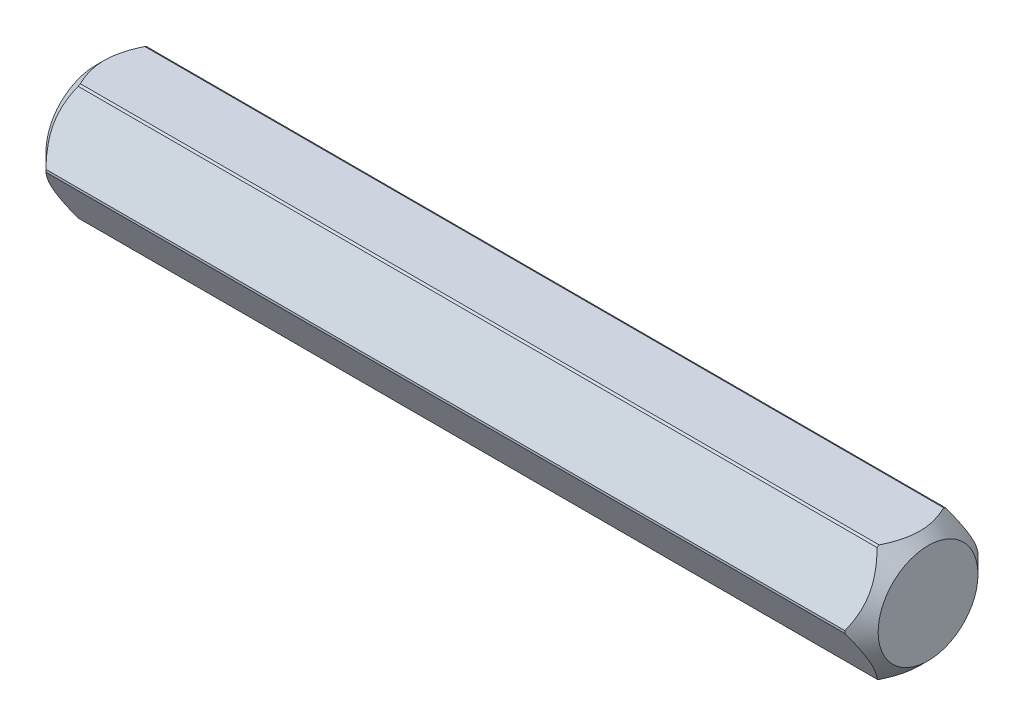
ISO-10303-21;
HEADER;
FILE_DESCRIPTION(('STEP AP214'),'2;1');
FILE_NAME('part.step','',(''),(''),'','','');
FILE_SCHEMA(('AUTOMOTIVE_DESIGN { 1 0 10303 214 1 1 1 1 }'));
ENDSEC;
DATA;
#1=APPLICATION_CONTEXT('core data for automotive mechanical design processes');
#2=APPLICATION_PROTOCOL_DEFINITION('international standard','automotive_design',2000,#1);
#3=PRODUCT_CONTEXT('',#1,'mechanical');
#4=PRODUCT('Part','Part','',(#3));
#5=PRODUCT_RELATED_PRODUCT_CATEGORY('part','',(#4));
#6=PRODUCT_DEFINITION_FORMATION('','',#4);
#7=PRODUCT_DEFINITION_CONTEXT('part definition',#1,'design');
#8=PRODUCT_DEFINITION('design','',#6,#7);
#9=PRODUCT_DEFINITION_SHAPE('','',#8);
#10=(LENGTH_UNIT() NAMED_UNIT(*) SI_UNIT(.MILLI.,.METRE.));
#11=(NAMED_UNIT(*) PLANE_ANGLE_UNIT() SI_UNIT($,.RADIAN.));
#12=(NAMED_UNIT(*) SI_UNIT($,.STERADIAN.) SOLID_ANGLE_UNIT());
#13=UNCERTAINTY_MEASURE_WITH_UNIT(LENGTH_MEASURE(1.E-05),#10,'distance_accuracy_value','');
#14=(GEOMETRIC_REPRESENTATION_CONTEXT(3) GLOBAL_UNCERTAINTY_ASSIGNED_CONTEXT((#13)) GLOBAL_UNIT_ASSIGNED_CONTEXT((#10,
#11,#12)) REPRESENTATION_CONTEXT('',''));
#15=CARTESIAN_POINT('',(0.,0.,0.));
#16=DIRECTION('',(0.,0.,1.));
#17=DIRECTION('',(1.,0.,0.));
#18=AXIS2_PLACEMENT_3D('',#15,#16,#17);
#19=CARTESIAN_POINT('',(-25.,0.,0.));
#20=DIRECTION('',(1.,0.,0.));
#21=DIRECTION('',(0.,0.,-1.));
#22=AXIS2_PLACEMENT_3D('',#19,#20,#21);
#23=CYLINDRICAL_SURFACE('',#22,4.);
#24=CARTESIAN_POINT('',(-24.,0.,0.));
#25=DIRECTION('',(1.,0.,0.));
#26=DIRECTION('',(0.,0.,-1.));
#27=AXIS2_PLACEMENT_3D('',#24,#25,#26);
#28=CIRCLE('',#27,4.);
#29=CARTESIAN_POINT('',(-24.,-3.49999999999999,-1.9364916731037));
#30=VERTEX_POINT('',#29);
#31=CARTESIAN_POINT('',(-24.,-3.42705098312483,-2.06284307669368));
#32=VERTEX_POINT('',#31);
#33=EDGE_CURVE('E440',#30,#32,#28,.T.);
#34=ORIENTED_EDGE('',*,*,#33,.T.);
#35=DIRECTION('',(1.,0.,0.));
#36=VECTOR('',#35,1.);
#37=CARTESIAN_POINT('',(-25.,-3.42705098312484,-2.06284307669368));
#38=LINE('',#37,#36);
#39=CARTESIAN_POINT('',(24.,-3.42705098312498,-2.06284307669377));
#40=VERTEX_POINT('',#39);
#41=EDGE_CURVE('E147',#32,#40,#38,.T.);
#42=ORIENTED_EDGE('',*,*,#41,.T.);
#43=CARTESIAN_POINT('',(24.,0.,0.));
#44=DIRECTION('',(1.,0.,0.));
#45=DIRECTION('',(0.,0.,-1.));
#46=AXIS2_PLACEMENT_3D('',#43,#44,#45);
#47=CIRCLE('',#46,4.00000000000016);
#48=CARTESIAN_POINT('',(24.,-3.50000000000014,-1.93649167310378));
#49=VERTEX_POINT('',#48);
#50=EDGE_CURVE('E129',#49,#40,#47,.T.);
#51=ORIENTED_EDGE('',*,*,#50,.F.);
#52=DIRECTION('',(1.,0.,0.));
#53=VECTOR('',#52,1.);
#54=CARTESIAN_POINT('',(-25.,-3.5,-1.93649167310371));
#55=LINE('',#54,#53);
#56=EDGE_CURVE('E184',#49,#30,#55,.F.);
#57=ORIENTED_EDGE('',*,*,#56,.T.);
#58=EDGE_LOOP('',(#34,#42,#51,#57));
#59=FACE_BOUND('',#58,.T.);
#60=ADVANCED_FACE('F34',(#59),#23,.T.);
#61=CARTESIAN_POINT('',(-24.,-3.42705098312483,2.06284307669368));
#62=VERTEX_POINT('',#61);
#63=CARTESIAN_POINT('',(-24.,-3.49999999999999,1.9364916731037));
#64=VERTEX_POINT('',#63);
#65=EDGE_CURVE('E441',#62,#64,#28,.T.);
#66=ORIENTED_EDGE('',*,*,#65,.T.);
#67=DIRECTION('',(1.,0.,0.));
#68=VECTOR('',#67,1.);
#69=CARTESIAN_POINT('',(-25.,-3.5,1.93649167310371));
#70=LINE('',#69,#68);
#71=CARTESIAN_POINT('',(24.,-3.50000000000014,1.93649167310378));
#72=VERTEX_POINT('',#71);
#73=EDGE_CURVE('E181',#64,#72,#70,.T.);
#74=ORIENTED_EDGE('',*,*,#73,.T.);
#75=CARTESIAN_POINT('',(24.,-3.42705098312498,2.06284307669377));
#76=VERTEX_POINT('',#75);
#77=EDGE_CURVE('E291',#76,#72,#47,.T.);
#78=ORIENTED_EDGE('',*,*,#77,.F.);
#79=DIRECTION('',(1.,0.,0.));
#80=VECTOR('',#79,1.);
#81=CARTESIAN_POINT('',(-25.,-3.42705098312484,2.06284307669368));
#82=LINE('',#81,#80);
#83=EDGE_CURVE('E178',#76,#62,#82,.F.);
#84=ORIENTED_EDGE('',*,*,#83,.T.);
#85=EDGE_LOOP('',(#66,#74,#78,#84));
#86=FACE_BOUND('',#85,.T.);
#87=ADVANCED_FACE('F313',(#86),#23,.T.);
#88=CARTESIAN_POINT('',(25.,-3.5,2.02072594216369));
#89=DIRECTION('',(0.,1.,0.));
#90=DIRECTION('',(0.,0.,1.));
#91=AXIS2_PLACEMENT_3D('',#88,#89,#90);
#92=PLANE('',#91);
#93=ORIENTED_EDGE('',*,*,#73,.F.);
#94=CARTESIAN_POINT('',(-22.7709558680861,-3.5,-3.88495849829863));
#95=CARTESIAN_POINT('',(-22.8417265480264,-3.5,-3.78968133394692));
#96=CARTESIAN_POINT('',(-22.9117700855367,-3.5,-3.69385487528351));
#97=CARTESIAN_POINT('',(-23.0500827467461,-3.5,-3.50089311148286));
#98=CARTESIAN_POINT('',(-23.1183513987054,-3.5,-3.40375746859152));
#99=CARTESIAN_POINT('',(-23.2532777385022,-3.5,-3.2072580078274));
#100=CARTESIAN_POINT('',(-23.3199188267687,-3.5,-3.10788275196362));
#101=CARTESIAN_POINT('',(-23.4505691255319,-3.5,-2.90742211475064));
#102=CARTESIAN_POINT('',(-23.5145785264957,-3.5,-2.80633685791198));
#103=CARTESIAN_POINT('',(-23.6426606486853,-3.5,-2.59685083146614));
#104=CARTESIAN_POINT('',(-23.7065611099663,-3.5,-2.48834419780517));
#105=CARTESIAN_POINT('',(-23.8299541720858,-3.5,-2.26881604459631));
#106=CARTESIAN_POINT('',(-23.8894461093925,-3.5,-2.15779414974395));
#107=CARTESIAN_POINT('',(-24.0027259556724,-3.5,-1.93327831467511));
#108=CARTESIAN_POINT('',(-24.0565306241052,-3.5,-1.81979289724819));
#109=CARTESIAN_POINT('',(-24.1572328785315,-3.5,-1.58982274079697));
#110=CARTESIAN_POINT('',(-24.2041334824992,-3.5,-1.47333933859964));
#111=CARTESIAN_POINT('',(-24.286625586809,-3.5,-1.24488640034047));
#112=CARTESIAN_POINT('',(-24.3227523498316,-3.5,-1.13311221328614));
#113=CARTESIAN_POINT('',(-24.3860160983735,-3.5,-0.906999927682235));
#114=CARTESIAN_POINT('',(-24.4131524219138,-3.5,-0.792661640995821));
#115=CARTESIAN_POINT('',(-24.45660507044,-3.5,-0.563937922740261));
#116=CARTESIAN_POINT('',(-24.4730982320116,-3.5,-0.449586630885616));
#117=CARTESIAN_POINT('',(-24.4949670259754,-3.5,-0.21982073380375));
#118=CARTESIAN_POINT('',(-24.5003442947431,-3.5,-0.104406287596969));
#119=CARTESIAN_POINT('',(-24.4996324107986,-3.5,0.122807086080186));
#120=CARTESIAN_POINT('',(-24.4938932489578,-3.5,0.234607276862984));
#121=CARTESIAN_POINT('',(-24.4720065025622,-3.5,0.457177593895896));
#122=CARTESIAN_POINT('',(-24.4558578645568,-3.5,0.567947614740591));
#123=CARTESIAN_POINT('',(-24.4137330630448,-3.5,0.789526981616912));
#124=CARTESIAN_POINT('',(-24.3875944740482,-3.5,0.900304973793903));
#125=CARTESIAN_POINT('',(-24.3268401155198,-3.5,1.11946317023785));
#126=CARTESIAN_POINT('',(-24.292225223604,-3.5,1.22784362147459));
#127=CARTESIAN_POINT('',(-24.2110957216561,-3.5,1.45550446207819));
#128=CARTESIAN_POINT('',(-24.1636324844728,-3.5,1.57444371012306));
#129=CARTESIAN_POINT('',(-24.0614691468719,-3.5,1.80919998437552));
#130=CARTESIAN_POINT('',(-24.0067655721685,-3.5,1.9250154793249));
#131=CARTESIAN_POINT('',(-23.891428291504,-3.5,2.15410976699733));
#132=CARTESIAN_POINT('',(-23.8307756469366,-3.5,2.26737894817478));
#133=CARTESIAN_POINT('',(-23.704886444562,-3.5,2.49129904370894));
#134=CARTESIAN_POINT('',(-23.6396506388391,-3.5,2.60195038368108));
#135=CARTESIAN_POINT('',(-23.508875432059,-3.5,2.81548535686267));
#136=CARTESIAN_POINT('',(-23.44351611644,-3.5,2.91847986431032));
#137=CARTESIAN_POINT('',(-23.3100853843749,-3.5,3.122702570174));
#138=CARTESIAN_POINT('',(-23.2420137607284,-3.5,3.22393063279394));
#139=CARTESIAN_POINT('',(-23.1042146186677,-3.5,3.42402444344006));
#140=CARTESIAN_POINT('',(-23.0345052932671,-3.5,3.52290276535771));
#141=CARTESIAN_POINT('',(-22.8932703209449,-3.5,3.71931403018213));
#142=CARTESIAN_POINT('',(-22.8217451769612,-3.5,3.81684733432182));
#143=CARTESIAN_POINT('',(-22.7494785924275,-3.5,3.91381847450509));
#144=B_SPLINE_CURVE_WITH_KNOTS('',3,(#94,#95,#96,#97,#98,#99,#100,#101,#102,#103,#104,#105,#106,
#107,#108,#109,#110,#111,#112,#113,#114,#115,#116,#117,#118,#119,#120,#121,#122,#123,#124,#125,
#126,#127,#128,#129,#130,#131,#132,#133,#134,#135,#136,#137,#138,#139,#140,#141,#142,#143),
.UNSPECIFIED.,.F.,.F.,(4,2,2,2,2,2,2,2,2,2,2,2,2,2,2,2,2,2,2,2,2,2,2,2,4),(0.,0.35606370037064,
0.71222108955131,1.07114059478682,1.43003407750445,1.80772404197995,2.18547073800351,
2.56207127489227,2.93850669636113,3.29059437190588,3.64270796641351,3.98880933311988,
4.33485974645869,4.67019194169244,5.00555807824441,5.34662632512483,5.6876592735368,
6.07153500226119,6.45559560667132,6.8409211903003,7.22618369008651,7.59208083700944,
7.9580059895793,8.32092560238972,8.68374576891416),.UNSPECIFIED.);
#145=EDGE_CURVE('E212',#64,#30,#144,.F.);
#146=ORIENTED_EDGE('',*,*,#145,.T.);
#147=ORIENTED_EDGE('',*,*,#56,.F.);
#148=CARTESIAN_POINT('',(22.7709558680862,-3.5,-3.88495849829873));
#149=CARTESIAN_POINT('',(22.8417265480265,-3.5,-3.78968133394703));
#150=CARTESIAN_POINT('',(22.9117700855368,-3.5,-3.69385487528361));
#151=CARTESIAN_POINT('',(23.0500827467462,-3.5,-3.50089311148296));
#152=CARTESIAN_POINT('',(23.1183513987055,-3.5,-3.40375746859162));
#153=CARTESIAN_POINT('',(23.2532777385023,-3.5,-3.20725800782749));
#154=CARTESIAN_POINT('',(23.3199188267688,-3.5,-3.10788275196371));
#155=CARTESIAN_POINT('',(23.450569125532,-3.5,-2.90742211475073));
#156=CARTESIAN_POINT('',(23.5145785264957,-3.5,-2.80633685791207));
#157=CARTESIAN_POINT('',(23.6426606486854,-3.5,-2.59685083146622));
#158=CARTESIAN_POINT('',(23.7065611099664,-3.5,-2.48834419780525));
#159=CARTESIAN_POINT('',(23.8299541720859,-3.5,-2.26881604459639));
#160=CARTESIAN_POINT('',(23.8894461093926,-3.5,-2.15779414974403));
#161=CARTESIAN_POINT('',(24.0027259556725,-3.5,-1.93327831467518));
#162=CARTESIAN_POINT('',(24.0565306241054,-3.5,-1.81979289724825));
#163=CARTESIAN_POINT('',(24.1572328785316,-3.5,-1.58982274079703));
#164=CARTESIAN_POINT('',(24.2041334824994,-3.5,-1.4733393385997));
#165=CARTESIAN_POINT('',(24.2866255868091,-3.5,-1.24488640034052));
#166=CARTESIAN_POINT('',(24.3227523498317,-3.5,-1.1331122132862));
#167=CARTESIAN_POINT('',(24.3860160983736,-3.5,-0.906999927682289));
#168=CARTESIAN_POINT('',(24.4131524219139,-3.5,-0.792661640995874));
#169=CARTESIAN_POINT('',(24.4566050704402,-3.5,-0.563937922740313));
#170=CARTESIAN_POINT('',(24.4730982320117,-3.5,-0.449586630885667));
#171=CARTESIAN_POINT('',(24.4949670259755,-3.5,-0.219820733803799));
#172=CARTESIAN_POINT('',(24.5003442947433,-3.5,-0.104406287597017));
#173=CARTESIAN_POINT('',(24.4996324107988,-3.5,0.12280708608014));
#174=CARTESIAN_POINT('',(24.493893248958,-3.5,0.234607276862938));
#175=CARTESIAN_POINT('',(24.4720065025623,-3.5,0.457177593895851));
#176=CARTESIAN_POINT('',(24.455857864557,-3.5,0.567947614740547));
#177=CARTESIAN_POINT('',(24.413733063045,-3.5,0.789526981616871));
#178=CARTESIAN_POINT('',(24.3875944740484,-3.5,0.900304973793862));
#179=CARTESIAN_POINT('',(24.3268401155199,-3.5,1.11946317023781));
#180=CARTESIAN_POINT('',(24.2922252236041,-3.5,1.22784362147455));
#181=CARTESIAN_POINT('',(24.2110957216563,-3.5,1.45550446207815));
#182=CARTESIAN_POINT('',(24.1636324844729,-3.5,1.57444371012301));
#183=CARTESIAN_POINT('',(24.0614691468721,-3.5,1.80919998437546));
#184=CARTESIAN_POINT('',(24.0067655721686,-3.5,1.92501547932484));
#185=CARTESIAN_POINT('',(23.8914282915042,-3.5,2.15410976699726));
#186=CARTESIAN_POINT('',(23.8307756469368,-3.5,2.26737894817471));
#187=CARTESIAN_POINT('',(23.7048864445622,-3.5,2.49129904370887));
#188=CARTESIAN_POINT('',(23.6396506388393,-3.5,2.601950383681));
#189=CARTESIAN_POINT('',(23.5088754320592,-3.5,2.81548535686258));
#190=CARTESIAN_POINT('',(23.4435161164402,-3.5,2.91847986431022));
#191=CARTESIAN_POINT('',(23.3100853843751,-3.5,3.12270257017389));
#192=CARTESIAN_POINT('',(23.2420137607286,-3.5,3.22393063279384));
#193=CARTESIAN_POINT('',(23.1042146186679,-3.5,3.42402444343994));
#194=CARTESIAN_POINT('',(23.0345052932673,-3.5,3.52290276535759));
#195=CARTESIAN_POINT('',(22.8932703209452,-3.5,3.719314030182));
#196=CARTESIAN_POINT('',(22.8217451769615,-3.5,3.81684733432168));
#197=CARTESIAN_POINT('',(22.7494785924277,-3.5,3.91381847450495));
#198=B_SPLINE_CURVE_WITH_KNOTS('',3,(#148,#149,#150,#151,#152,#153,#154,#155,#156,#157,#158,
#159,#160,#161,#162,#163,#164,#165,#166,#167,#168,#169,#170,#171,#172,#173,#174,#175,#176,#177,
#178,#179,#180,#181,#182,#183,#184,#185,#186,#187,#188,#189,#190,#191,#192,#193,#194,#195,#196,
#197),.UNSPECIFIED.,.F.,.F.,(4,2,2,2,2,2,2,2,2,2,2,2,2,2,2,2,2,2,2,2,2,2,2,2,4),(0.,
0.35606370037065,0.712221089551328,1.07114059478685,1.43003407750449,1.80772404198,
2.18547073800357,2.56207127489234,2.93850669636121,3.29059437190597,3.6427079664136,
3.98880933311997,4.33485974645878,4.67019194169253,5.00555807824451,5.34662632512493,
5.6876592735369,6.07153500226128,6.45559560667139,6.84092119030036,7.22618369008655,
7.59208083700947,7.9580059895793,8.32092560238972,8.68374576891414),.UNSPECIFIED.);
#199=EDGE_CURVE('E297',#49,#72,#198,.T.);
#200=ORIENTED_EDGE('',*,*,#199,.T.);
#201=EDGE_LOOP('',(#93,#146,#147,#200));
#202=FACE_BOUND('',#201,.T.);
#203=ADVANCED_FACE('F309',(#202),#92,.F.);
#204=CARTESIAN_POINT('',(-24.,0.0729490168751582,3.99933474979738));
#205=VERTEX_POINT('',#204);
#206=CARTESIAN_POINT('',(-24.,-0.0729490168751597,3.99933474979738));
#207=VERTEX_POINT('',#206);
#208=EDGE_CURVE('E288',#205,#207,#28,.T.);
#209=ORIENTED_EDGE('',*,*,#208,.T.);
#210=DIRECTION('',(1.,0.,0.));
#211=VECTOR('',#210,1.);
#212=CARTESIAN_POINT('',(-25.,-0.0729490168751598,3.99933474979739));
#213=LINE('',#212,#211);
#214=CARTESIAN_POINT('',(24.,-0.0729490168751628,3.99933474979755));
#215=VERTEX_POINT('',#214);
#216=EDGE_CURVE('E175',#207,#215,#213,.T.);
#217=ORIENTED_EDGE('',*,*,#216,.T.);
#218=CARTESIAN_POINT('',(24.,0.0729490168751613,3.99933474979755));
#219=VERTEX_POINT('',#218);
#220=EDGE_CURVE('E289',#219,#215,#47,.T.);
#221=ORIENTED_EDGE('',*,*,#220,.F.);
#222=DIRECTION('',(1.,0.,0.));
#223=VECTOR('',#222,1.);
#224=CARTESIAN_POINT('',(-25.,0.0729490168751587,3.99933474979739));
#225=LINE('',#224,#223);
#226=EDGE_CURVE('E172',#219,#205,#225,.F.);
#227=ORIENTED_EDGE('',*,*,#226,.T.);
#228=EDGE_LOOP('',(#209,#217,#221,#227));
#229=FACE_BOUND('',#228,.T.);
#230=ADVANCED_FACE('F287',(#229),#23,.T.);
#231=CARTESIAN_POINT('',(25.,0.,4.04145188432738));
#232=DIRECTION('',(0.,0.5,-0.866025403784439));
#233=DIRECTION('',(0.,0.866025403784439,0.5));
#234=AXIS2_PLACEMENT_3D('',#231,#232,#233);
#235=PLANE('',#234);
#236=ORIENTED_EDGE('',*,*,#216,.F.);
#237=CARTESIAN_POINT('',(-23.9998881914971,-0.0727490168751598,3.99945021985123));
#238=CARTESIAN_POINT('',(-24.0647344125967,-0.188821920569182,3.93243549765786));
#239=CARTESIAN_POINT('',(-24.1255786856644,-0.306792015062138,3.86432543184603));
#240=CARTESIAN_POINT('',(-24.236631721576,-0.547102653177954,3.72558202024073));
#241=CARTESIAN_POINT('',(-24.2867840411528,-0.669462591619545,3.65493747684345));
#242=CARTESIAN_POINT('',(-24.3724702813315,-0.91614076389249,3.51251776767846));
#243=CARTESIAN_POINT('',(-24.40820449415,-1.04040534792581,3.44077357663609));
#244=CARTESIAN_POINT('',(-24.4630245319927,-1.29146280524845,3.2958254860688));
#245=CARTESIAN_POINT('',(-24.4821471825275,-1.41824944542652,3.22262518523234));
#246=CARTESIAN_POINT('',(-24.4994162555897,-1.64030659912094,3.09442042777139));
#247=CARTESIAN_POINT('',(-24.5016761760365,-1.73534567507848,3.03954959168377));
#248=CARTESIAN_POINT('',(-24.4958688245799,-1.92522209566854,2.92992438914334));
#249=CARTESIAN_POINT('',(-24.4877980805933,-2.02005936174115,2.8751700680471));
#250=CARTESIAN_POINT('',(-24.4617912511374,-2.20878765148148,2.76620773916183));
#251=CARTESIAN_POINT('',(-24.4438458023951,-2.30267769080182,2.712000299686));
#252=CARTESIAN_POINT('',(-24.3990644171695,-2.4888139246395,2.60453449497388));
#253=CARTESIAN_POINT('',(-24.3722292687286,-2.58106026410183,2.55127604605354));
#254=CARTESIAN_POINT('',(-24.2978081761365,-2.80245994340965,2.42345088160668));
#255=CARTESIAN_POINT('',(-24.2462514082613,-2.93061340815026,2.3494614442411));
#256=CARTESIAN_POINT('',(-24.1599489411141,-3.11942583820546,2.24045053692239));
#257=CARTESIAN_POINT('',(-24.1297390066745,-3.18170263306291,2.20449501264717));
#258=CARTESIAN_POINT('',(-24.0666935419959,-3.30522701709022,2.13317817627752));
#259=CARTESIAN_POINT('',(-24.0338589491642,-3.36647496434285,2.0978166574439));
#260=CARTESIAN_POINT('',(-23.9998881914971,-3.42725098312484,2.06272760663985));
#261=B_SPLINE_CURVE_WITH_KNOTS('',3,(#237,#238,#239,#240,#241,#242,#243,#244,#245,#246,#247,
#248,#249,#250,#251,#252,#253,#254,#255,#256,#257,#258,#259,#260),.UNSPECIFIED.,.F.,.F.,(4,2,2,
2,2,2,2,2,2,2,2,4),(0.,0.446958060798133,0.896220203678145,1.33900659915567,1.78080887560878,
2.10963588118586,2.43857343285385,2.7678234245162,3.09704423706709,3.56636893069618,
3.80032900351679,4.03420588673433),.UNSPECIFIED.);
#262=EDGE_CURVE('E222',#207,#62,#261,.T.);
#263=ORIENTED_EDGE('',*,*,#262,.T.);
#264=ORIENTED_EDGE('',*,*,#83,.F.);
#265=CARTESIAN_POINT('',(23.9998881914972,-3.42725098312484,2.06272760663984));
#266=CARTESIAN_POINT('',(24.0647344125968,-3.31117807943082,2.12974232883321));
#267=CARTESIAN_POINT('',(24.1255786856645,-3.19320798493787,2.19785239464504));
#268=CARTESIAN_POINT('',(24.2366317215761,-2.95289734682205,2.33659580625034));
#269=CARTESIAN_POINT('',(24.286784041153,-2.83053740838046,2.40724034964762));
#270=CARTESIAN_POINT('',(24.3724702813317,-2.58385923610752,2.54966005881261));
#271=CARTESIAN_POINT('',(24.4082044941501,-2.4595946520742,2.62140424985498));
#272=CARTESIAN_POINT('',(24.4630245319929,-2.20853719475155,2.76635234042227));
#273=CARTESIAN_POINT('',(24.4821471825276,-2.08175055457349,2.83955264125873));
#274=CARTESIAN_POINT('',(24.4994162555899,-1.85969340087907,2.96775739871968));
#275=CARTESIAN_POINT('',(24.5016761760366,-1.76465432492153,3.0226282348073));
#276=CARTESIAN_POINT('',(24.4958688245801,-1.57477790433148,3.13225343734773));
#277=CARTESIAN_POINT('',(24.4877980805935,-1.47994063825886,3.18700775844396));
#278=CARTESIAN_POINT('',(24.4617912511376,-1.29121234851854,3.29597008732924));
#279=CARTESIAN_POINT('',(24.4438458023953,-1.1973223091982,3.35017752680506));
#280=CARTESIAN_POINT('',(24.3990644171697,-1.01118607536052,3.45764333151719));
#281=CARTESIAN_POINT('',(24.3722292687288,-0.918939735898186,3.51090178043752));
#282=CARTESIAN_POINT('',(24.2978081761367,-0.697540056590371,3.63872694488438));
#283=CARTESIAN_POINT('',(24.2462514082614,-0.569386591849757,3.71271638224996));
#284=CARTESIAN_POINT('',(24.1599489411143,-0.380574161794552,3.82172728956868));
#285=CARTESIAN_POINT('',(24.1297390066747,-0.318297366937095,3.8576828138439));
#286=CARTESIAN_POINT('',(24.066693541996,-0.194772982909786,3.92899965021355));
#287=CARTESIAN_POINT('',(24.0338589491643,-0.133525035657156,3.96436116904717));
#288=CARTESIAN_POINT('',(23.9998881914973,-0.0727490168751602,3.99945021985123));
#289=B_SPLINE_CURVE_WITH_KNOTS('',3,(#265,#266,#267,#268,#269,#270,#271,#272,#273,#274,#275,
#276,#277,#278,#279,#280,#281,#282,#283,#284,#285,#286,#287,#288),.UNSPECIFIED.,.F.,.F.,(4,2,2,
2,2,2,2,2,2,2,2,4),(0.,0.446958060798129,0.896220203678143,1.33900659915567,1.78080887560878,
2.10963588118585,2.43857343285383,2.76782342451619,3.09704423706706,3.56636893069617,
3.80032900351678,4.03420588673433),.UNSPECIFIED.);
#290=EDGE_CURVE('E304',#76,#215,#289,.T.);
#291=ORIENTED_EDGE('',*,*,#290,.T.);
#292=EDGE_LOOP('',(#236,#263,#264,#291));
#293=FACE_BOUND('',#292,.T.);
#294=ADVANCED_FACE('F315',(#293),#235,.F.);
#295=CARTESIAN_POINT('',(-24.,3.5,1.93649167310371));
#296=VERTEX_POINT('',#295);
#297=CARTESIAN_POINT('',(-24.,3.42705098312484,2.06284307669368));
#298=VERTEX_POINT('',#297);
#299=EDGE_CURVE('E298',#296,#298,#28,.T.);
#300=ORIENTED_EDGE('',*,*,#299,.T.);
#301=DIRECTION('',(1.,0.,0.));
#302=VECTOR('',#301,1.);
#303=CARTESIAN_POINT('',(-25.,3.42705098312484,2.06284307669368));
#304=LINE('',#303,#302);
#305=CARTESIAN_POINT('',(24.,3.42705098312499,2.06284307669377));
#306=VERTEX_POINT('',#305);
#307=EDGE_CURVE('E167',#298,#306,#304,.T.);
#308=ORIENTED_EDGE('',*,*,#307,.T.);
#309=CARTESIAN_POINT('',(24.,3.50000000000015,1.93649167310379));
#310=VERTEX_POINT('',#309);
#311=EDGE_CURVE('E131',#310,#306,#47,.T.);
#312=ORIENTED_EDGE('',*,*,#311,.F.);
#313=DIRECTION('',(1.,0.,0.));
#314=VECTOR('',#313,1.);
#315=CARTESIAN_POINT('',(-25.,3.5,1.93649167310371));
#316=LINE('',#315,#314);
#317=EDGE_CURVE('E163',#310,#296,#316,.F.);
#318=ORIENTED_EDGE('',*,*,#317,.T.);
#319=EDGE_LOOP('',(#300,#308,#312,#318));
#320=FACE_BOUND('',#319,.T.);
#321=ADVANCED_FACE('F319',(#320),#23,.T.);
#322=CARTESIAN_POINT('',(25.,3.5,2.02072594216369));
#323=DIRECTION('',(0.,-0.5,-0.866025403784439));
#324=DIRECTION('',(0.,0.866025403784439,-0.5));
#325=AXIS2_PLACEMENT_3D('',#322,#323,#324);
#326=PLANE('',#325);
#327=ORIENTED_EDGE('',*,*,#307,.F.);
#328=CARTESIAN_POINT('',(-23.9998881914971,3.42725098312484,2.06272760663984));
#329=CARTESIAN_POINT('',(-24.0647344125967,3.31117807943082,2.12974232883321));
#330=CARTESIAN_POINT('',(-24.1255786856644,3.19320798493786,2.19785239464504));
#331=CARTESIAN_POINT('',(-24.236631721576,2.95289734682205,2.33659580625034));
#332=CARTESIAN_POINT('',(-24.2867840411528,2.83053740838046,2.40724034964762));
#333=CARTESIAN_POINT('',(-24.3724702813315,2.58385923610751,2.54966005881261));
#334=CARTESIAN_POINT('',(-24.40820449415,2.4595946520742,2.62140424985498));
#335=CARTESIAN_POINT('',(-24.4630245319927,2.20853719475155,2.76635234042227));
#336=CARTESIAN_POINT('',(-24.4821471825275,2.08175055457348,2.83955264125873));
#337=CARTESIAN_POINT('',(-24.4994162555897,1.85969340087906,2.96775739871968));
#338=CARTESIAN_POINT('',(-24.5016761760365,1.76465432492152,3.0226282348073));
#339=CARTESIAN_POINT('',(-24.4958688245799,1.57477790433147,3.13225343734773));
#340=CARTESIAN_POINT('',(-24.4877980805933,1.47994063825885,3.18700775844397));
#341=CARTESIAN_POINT('',(-24.4617912511374,1.29121234851852,3.29597008732924));
#342=CARTESIAN_POINT('',(-24.4438458023951,1.19732230919818,3.35017752680507));
#343=CARTESIAN_POINT('',(-24.3990644171695,1.0111860753605,3.45764333151719));
#344=CARTESIAN_POINT('',(-24.3722292687286,0.918939735898169,3.51090178043753));
#345=CARTESIAN_POINT('',(-24.2978081761365,0.697540056590355,3.63872694488439));
#346=CARTESIAN_POINT('',(-24.2462514082613,0.569386591849744,3.71271638224997));
#347=CARTESIAN_POINT('',(-24.1599489411141,0.380574161794542,3.82172728956869));
#348=CARTESIAN_POINT('',(-24.1297390066745,0.318297366937086,3.8576828138439));
#349=CARTESIAN_POINT('',(-24.0666935419959,0.194772982909779,3.92899965021355));
#350=CARTESIAN_POINT('',(-24.0338589491642,0.133525035657151,3.96436116904717));
#351=CARTESIAN_POINT('',(-23.9998881914971,0.0727490168751573,3.99945021985123));
#352=B_SPLINE_CURVE_WITH_KNOTS('',3,(#328,#329,#330,#331,#332,#333,#334,#335,#336,#337,#338,
#339,#340,#341,#342,#343,#344,#345,#346,#347,#348,#349,#350,#351),.UNSPECIFIED.,.F.,.F.,(4,2,2,
2,2,2,2,2,2,2,2,4),(0.,0.446958060798131,0.896220203678143,1.33900659915567,1.78080887560878,
2.10963588118586,2.43857343285384,2.7678234245162,3.09704423706708,3.56636893069618,
3.80032900351679,4.03420588673433),.UNSPECIFIED.);
#353=EDGE_CURVE('E230',#298,#205,#352,.T.);
#354=ORIENTED_EDGE('',*,*,#353,.T.);
#355=ORIENTED_EDGE('',*,*,#226,.F.);
#356=CARTESIAN_POINT('',(23.9998881914973,0.0727490168751583,3.99945021985123));
#357=CARTESIAN_POINT('',(24.0647344125968,0.18882192056918,3.93243549765786));
#358=CARTESIAN_POINT('',(24.1255786856645,0.306792015062135,3.86432543184603));
#359=CARTESIAN_POINT('',(24.2366317215761,0.547102653177949,3.72558202024073));
#360=CARTESIAN_POINT('',(24.286784041153,0.669462591619539,3.65493747684345));
#361=CARTESIAN_POINT('',(24.3724702813317,0.916140763892482,3.51251776767847));
#362=CARTESIAN_POINT('',(24.4082044941501,1.0404053479258,3.44077357663609));
#363=CARTESIAN_POINT('',(24.4630245319929,1.29146280524844,3.2958254860688));
#364=CARTESIAN_POINT('',(24.4821471825276,1.41824944542651,3.22262518523235));
#365=CARTESIAN_POINT('',(24.4994162555899,1.64030659912093,3.09442042777139));
#366=CARTESIAN_POINT('',(24.5016761760366,1.73534567507847,3.03954959168378));
#367=CARTESIAN_POINT('',(24.4958688245801,1.92522209566852,2.92992438914335));
#368=CARTESIAN_POINT('',(24.4877980805935,2.02005936174113,2.87517006804711));
#369=CARTESIAN_POINT('',(24.4617912511376,2.20878765148146,2.76620773916184));
#370=CARTESIAN_POINT('',(24.4438458023953,2.3026776908018,2.71200029968602));
#371=CARTESIAN_POINT('',(24.3990644171697,2.48881392463948,2.60453449497389));
#372=CARTESIAN_POINT('',(24.3722292687288,2.58106026410181,2.55127604605356));
#373=CARTESIAN_POINT('',(24.2978081761367,2.80245994340962,2.42345088160669));
#374=CARTESIAN_POINT('',(24.2462514082614,2.93061340815024,2.34946144424111));
#375=CARTESIAN_POINT('',(24.1599489411143,3.11942583820545,2.24045053692239));
#376=CARTESIAN_POINT('',(24.1297390066747,3.1817026330629,2.20449501264717));
#377=CARTESIAN_POINT('',(24.0666935419961,3.30522701709021,2.13317817627752));
#378=CARTESIAN_POINT('',(24.0338589491643,3.36647496434285,2.0978166574439));
#379=CARTESIAN_POINT('',(23.9998881914973,3.42725098312484,2.06272760663984));
#380=B_SPLINE_CURVE_WITH_KNOTS('',3,(#356,#357,#358,#359,#360,#361,#362,#363,#364,#365,#366,
#367,#368,#369,#370,#371,#372,#373,#374,#375,#376,#377,#378,#379),.UNSPECIFIED.,.F.,.F.,(4,2,2,
2,2,2,2,2,2,2,2,4),(0.,0.446958060798129,0.896220203678141,1.33900659915567,1.78080887560878,
2.10963588118585,2.43857343285383,2.76782342451618,3.09704423706706,3.56636893069617,
3.80032900351678,4.03420588673434),.UNSPECIFIED.);
#381=EDGE_CURVE('E164',#219,#306,#380,.T.);
#382=ORIENTED_EDGE('',*,*,#381,.T.);
#383=EDGE_LOOP('',(#327,#354,#355,#382));
#384=FACE_BOUND('',#383,.T.);
#385=ADVANCED_FACE('F243',(#384),#326,.F.);
#386=CARTESIAN_POINT('',(-24.,0.,0.));
#387=DIRECTION('',(1.,0.,0.));
#388=DIRECTION('',(0.,0.,-1.));
#389=AXIS2_PLACEMENT_3D('',#386,#387,#388);
#390=CIRCLE('',#389,4.);
#391=CARTESIAN_POINT('',(-24.,3.5,-1.93649167310371));
#392=VERTEX_POINT('',#391);
#393=CARTESIAN_POINT('',(-24.,3.42705098312484,-2.06284307669368));
#394=VERTEX_POINT('',#393);
#395=EDGE_CURVE('E11',#392,#394,#390,.F.);
#396=ORIENTED_EDGE('',*,*,#395,.F.);
#397=DIRECTION('',(1.,0.,0.));
#398=VECTOR('',#397,1.);
#399=CARTESIAN_POINT('',(-25.,3.5,-1.93649167310371));
#400=LINE('',#399,#398);
#401=CARTESIAN_POINT('',(24.,3.50000000000015,-1.93649167310379));
#402=VERTEX_POINT('',#401);
#403=EDGE_CURVE('E149',#392,#402,#400,.T.);
#404=ORIENTED_EDGE('',*,*,#403,.T.);
#405=CARTESIAN_POINT('',(24.0000000000001,0.,0.));
#406=DIRECTION('',(-1.,0.,0.));
#407=DIRECTION('',(0.,0.,1.));
#408=AXIS2_PLACEMENT_3D('',#405,#406,#407);
#409=CIRCLE('',#408,4.);
#410=CARTESIAN_POINT('',(24.0000000000002,3.42705098312484,-2.06284307669368));
#411=VERTEX_POINT('',#410);
#412=EDGE_CURVE('E43',#411,#402,#409,.F.);
#413=ORIENTED_EDGE('',*,*,#412,.F.);
#414=DIRECTION('',(1.,0.,0.));
#415=VECTOR('',#414,1.);
#416=CARTESIAN_POINT('',(-25.,3.42705098312484,-2.06284307669368));
#417=LINE('',#416,#415);
#418=EDGE_CURVE('E139',#411,#394,#417,.F.);
#419=ORIENTED_EDGE('',*,*,#418,.T.);
#420=EDGE_LOOP('',(#396,#404,#413,#419));
#421=FACE_BOUND('',#420,.T.);
#422=ADVANCED_FACE('F166',(#421),#23,.T.);
#423=CARTESIAN_POINT('',(25.,3.5,-2.02072594216369));
#424=DIRECTION('',(0.,-1.,0.));
#425=DIRECTION('',(0.,0.,-1.));
#426=AXIS2_PLACEMENT_3D('',#423,#424,#425);
#427=PLANE('',#426);
#428=ORIENTED_EDGE('',*,*,#403,.F.);
#429=CARTESIAN_POINT('',(-22.7709558684879,3.5,-3.88495849775788));
#430=CARTESIAN_POINT('',(-22.8417265484128,3.5,-3.78968133342095));
#431=CARTESIAN_POINT('',(-22.9117700859077,3.5,-3.69385487477237));
#432=CARTESIAN_POINT('',(-23.0500827470864,3.5,-3.50089311100154));
#433=CARTESIAN_POINT('',(-23.1183513990305,3.5,-3.40375746812518));
#434=CARTESIAN_POINT('',(-23.2532777387966,3.5,-3.20725800739154));
#435=CARTESIAN_POINT('',(-23.3199188270477,3.5,-3.10788275154327));
#436=CARTESIAN_POINT('',(-23.4505691257804,3.5,-2.90742211436158));
#437=CARTESIAN_POINT('',(-23.514578526729,3.5,-2.80633685753872));
#438=CARTESIAN_POINT('',(-23.6426606488873,3.5,-2.59685083112691));
#439=CARTESIAN_POINT('',(-23.7065611101521,3.5,-2.48834419748423));
#440=CARTESIAN_POINT('',(-23.8299541722399,3.5,-2.26881604431261));
#441=CARTESIAN_POINT('',(-23.8894461095311,3.5,-2.1577941494792));
#442=CARTESIAN_POINT('',(-24.0027259557815,3.5,-1.93327831444895));
#443=CARTESIAN_POINT('',(-24.0565306242001,3.5,-1.81979289704167));
#444=CARTESIAN_POINT('',(-24.1572328785998,3.5,-1.58982274063076));
#445=CARTESIAN_POINT('',(-24.2041334825552,3.5,-1.47333933845411));
#446=CARTESIAN_POINT('',(-24.2866255868551,3.5,-1.24488640020413));
#447=CARTESIAN_POINT('',(-24.3227523498778,3.5,-1.13311221313747));
#448=CARTESIAN_POINT('',(-24.3860160984175,3.5,-0.906999927508549));
#449=CARTESIAN_POINT('',(-24.4131524219554,3.5,-0.792661640809463));
#450=CARTESIAN_POINT('',(-24.4566050704741,3.5,-0.56393792252901));
#451=CARTESIAN_POINT('',(-24.4730982320405,3.5,-0.449586630662147));
#452=CARTESIAN_POINT('',(-24.4949670259913,3.5,-0.219820733556327));
#453=CARTESIAN_POINT('',(-24.5003442947512,3.5,-0.104406287337812));
#454=CARTESIAN_POINT('',(-24.4996324107891,3.5,0.122807086362552));
#455=CARTESIAN_POINT('',(-24.4938932489385,3.5,0.234607277156851));
#456=CARTESIAN_POINT('',(-24.4720065025216,3.5,0.457177594211704));
#457=CARTESIAN_POINT('',(-24.4558578645048,3.5,0.56794761506684));
#458=CARTESIAN_POINT('',(-24.4137330629687,3.5,0.789526981963771));
#459=CARTESIAN_POINT('',(-24.3875944739594,3.5,0.900304974150904));
#460=CARTESIAN_POINT('',(-24.3268401154052,3.5,1.11946317061423));
#461=CARTESIAN_POINT('',(-24.2922252234764,3.5,1.2278436218602));
#462=CARTESIAN_POINT('',(-24.2110957214907,3.5,1.45550446251118));
#463=CARTESIAN_POINT('',(-24.1636324842805,3.5,1.57444371059335));
#464=CARTESIAN_POINT('',(-24.0614691466232,3.5,1.80919998491849));
#465=CARTESIAN_POINT('',(-24.0067655718902,3.5,1.92501547990327));
#466=CARTESIAN_POINT('',(-23.8914282911649,3.5,2.15410976764521));
#467=CARTESIAN_POINT('',(-23.8307756465661,3.5,2.26737894885677));
#468=CARTESIAN_POINT('',(-23.7048864441279,3.5,2.49129904445806));
#469=CARTESIAN_POINT('',(-23.6396506383727,3.5,2.6019503844632));
#470=CARTESIAN_POINT('',(-23.5088754315313,3.5,2.81548535770485));
#471=CARTESIAN_POINT('',(-23.4435161158834,3.5,2.91847986517966));
#472=CARTESIAN_POINT('',(-23.3100853837604,3.5,3.12270257109727));
#473=CARTESIAN_POINT('',(-23.2420137600848,3.5,3.22393063374399));
#474=CARTESIAN_POINT('',(-23.1042146179664,3.5,3.42402444444302));
#475=CARTESIAN_POINT('',(-23.0345052925371,3.5,3.52290276638681));
#476=CARTESIAN_POINT('',(-22.8932703201576,3.5,3.71931403126334));
#477=CARTESIAN_POINT('',(-22.8217451761452,3.5,3.816847335429));
#478=CARTESIAN_POINT('',(-22.7494785915828,3.5,3.91381847563821));
#479=B_SPLINE_CURVE_WITH_KNOTS('',3,(#429,#430,#431,#432,#433,#434,#435,#436,#437,#438,#439,
#440,#441,#442,#443,#444,#445,#446,#447,#448,#449,#450,#451,#452,#453,#454,#455,#456,#457,#458,
#459,#460,#461,#462,#463,#464,#465,#466,#467,#468,#469,#470,#471,#472,#473,#474,#475,#476,#477,
#478),.UNSPECIFIED.,.F.,.F.,(4,2,2,2,2,2,2,2,2,2,2,2,2,2,2,2,2,2,2,2,2,2,2,2,4),(0.,
0.356063700307519,0.712221089425046,1.07114059459624,1.43003407724955,1.80772404165311,
2.1854707376047,2.56207127442207,2.93850669581966,3.29059437139963,3.64270796594242,
3.98880933268266,4.33485974605535,4.67019194132493,5.00555807791277,5.34662632483152,
5.6876592732818,6.07153500213982,6.45559560668375,6.84092119044729,7.226183690368,
7.59208083740619,7.9580059900913,8.32092560301543,8.68374576965355),.UNSPECIFIED.);
#480=EDGE_CURVE('E49',#392,#296,#479,.T.);
#481=ORIENTED_EDGE('',*,*,#480,.T.);
#482=ORIENTED_EDGE('',*,*,#317,.F.);
#483=CARTESIAN_POINT('',(22.770955868488,3.5,-3.88495849775799));
#484=CARTESIAN_POINT('',(22.8417265484129,3.5,-3.78968133342106));
#485=CARTESIAN_POINT('',(22.9117700859078,3.5,-3.69385487477247));
#486=CARTESIAN_POINT('',(23.0500827470865,3.5,-3.50089311100164));
#487=CARTESIAN_POINT('',(23.1183513990306,3.5,-3.40375746812528));
#488=CARTESIAN_POINT('',(23.2532777387967,3.5,-3.20725800739164));
#489=CARTESIAN_POINT('',(23.3199188270478,3.5,-3.10788275154336));
#490=CARTESIAN_POINT('',(23.4505691257805,3.5,-2.90742211436168));
#491=CARTESIAN_POINT('',(23.5145785267291,3.5,-2.80633685753881));
#492=CARTESIAN_POINT('',(23.6426606488874,3.5,-2.596850831127));
#493=CARTESIAN_POINT('',(23.7065611101522,3.5,-2.48834419748431));
#494=CARTESIAN_POINT('',(23.82995417224,3.5,-2.26881604431269));
#495=CARTESIAN_POINT('',(23.8894461095312,3.5,-2.15779414947928));
#496=CARTESIAN_POINT('',(24.0027259557816,3.5,-1.93327831444902));
#497=CARTESIAN_POINT('',(24.0565306242003,3.5,-1.81979289704174));
#498=CARTESIAN_POINT('',(24.1572328785999,3.5,-1.58982274063083));
#499=CARTESIAN_POINT('',(24.2041334825553,3.5,-1.47333933845417));
#500=CARTESIAN_POINT('',(24.2866255868552,3.5,-1.24488640020419));
#501=CARTESIAN_POINT('',(24.322752349878,3.5,-1.13311221313753));
#502=CARTESIAN_POINT('',(24.3860160984176,3.5,-0.906999927508603));
#503=CARTESIAN_POINT('',(24.4131524219555,3.5,-0.792661640809517));
#504=CARTESIAN_POINT('',(24.4566050704742,3.5,-0.563937922529062));
#505=CARTESIAN_POINT('',(24.4730982320407,3.5,-0.449586630662198));
#506=CARTESIAN_POINT('',(24.4949670259914,3.5,-0.219820733556376));
#507=CARTESIAN_POINT('',(24.5003442947514,3.5,-0.104406287337859));
#508=CARTESIAN_POINT('',(24.4996324107893,3.5,0.122807086362507));
#509=CARTESIAN_POINT('',(24.4938932489386,3.5,0.234607277156806));
#510=CARTESIAN_POINT('',(24.4720065025217,3.5,0.45717759421166));
#511=CARTESIAN_POINT('',(24.455857864505,3.5,0.567947615066796));
#512=CARTESIAN_POINT('',(24.4137330629689,3.5,0.789526981963729));
#513=CARTESIAN_POINT('',(24.3875944739596,3.5,0.900304974150864));
#514=CARTESIAN_POINT('',(24.3268401154054,3.5,1.11946317061419));
#515=CARTESIAN_POINT('',(24.2922252234766,3.5,1.22784362186017));
#516=CARTESIAN_POINT('',(24.2110957214909,3.5,1.45550446251114));
#517=CARTESIAN_POINT('',(24.1636324842807,3.5,1.5744437105933));
#518=CARTESIAN_POINT('',(24.0614691466234,3.5,1.80919998491844));
#519=CARTESIAN_POINT('',(24.0067655718904,3.5,1.92501547990321));
#520=CARTESIAN_POINT('',(23.8914282911651,3.5,2.15410976764514));
#521=CARTESIAN_POINT('',(23.8307756465663,3.5,2.26737894885669));
#522=CARTESIAN_POINT('',(23.7048864441281,3.5,2.49129904445797));
#523=CARTESIAN_POINT('',(23.6396506383729,3.5,2.60195038446311));
#524=CARTESIAN_POINT('',(23.5088754315315,3.5,2.81548535770476));
#525=CARTESIAN_POINT('',(23.4435161158836,3.5,2.91847986517955));
#526=CARTESIAN_POINT('',(23.3100853837606,3.5,3.12270257109716));
#527=CARTESIAN_POINT('',(23.2420137600851,3.5,3.22393063374388));
#528=CARTESIAN_POINT('',(23.1042146179666,3.5,3.4240244444429));
#529=CARTESIAN_POINT('',(23.0345052925373,3.5,3.52290276638669));
#530=CARTESIAN_POINT('',(22.8932703201578,3.5,3.71931403126321));
#531=CARTESIAN_POINT('',(22.8217451761454,3.5,3.81684733542887));
#532=CARTESIAN_POINT('',(22.7494785915831,3.5,3.91381847563807));
#533=B_SPLINE_CURVE_WITH_KNOTS('',3,(#483,#484,#485,#486,#487,#488,#489,#490,#491,#492,#493,
#494,#495,#496,#497,#498,#499,#500,#501,#502,#503,#504,#505,#506,#507,#508,#509,#510,#511,#512,
#513,#514,#515,#516,#517,#518,#519,#520,#521,#522,#523,#524,#525,#526,#527,#528,#529,#530,#531,
#532),.UNSPECIFIED.,.F.,.F.,(4,2,2,2,2,2,2,2,2,2,2,2,2,2,2,2,2,2,2,2,2,2,2,2,4),(0.,
0.356063700307526,0.712221089425062,1.07114059459626,1.43003407724958,1.80772404165316,
2.18547073760476,2.56207127442214,2.93850669581974,3.29059437139971,3.6427079659425,
3.98880933268275,4.33485974605545,4.67019194132503,5.00555807791287,5.34662632483161,
5.6876592732819,6.0715350021399,6.45559560668382,6.84092119044734,7.22618369036803,
7.59208083740621,7.95800599009131,8.32092560301541,8.68374576965352),.UNSPECIFIED.);
#534=EDGE_CURVE('E140',#310,#402,#533,.F.);
#535=ORIENTED_EDGE('',*,*,#534,.T.);
#536=EDGE_LOOP('',(#428,#481,#482,#535));
#537=FACE_BOUND('',#536,.T.);
#538=ADVANCED_FACE('F161',(#537),#427,.F.);
#539=CARTESIAN_POINT('',(-24.,-0.0729490168751567,-3.99933474979738));
#540=VERTEX_POINT('',#539);
#541=CARTESIAN_POINT('',(-24.,0.0729490168751578,-3.99933474979738));
#542=VERTEX_POINT('',#541);
#543=EDGE_CURVE('E144',#540,#542,#28,.T.);
#544=ORIENTED_EDGE('',*,*,#543,.T.);
#545=DIRECTION('',(1.,0.,0.));
#546=VECTOR('',#545,1.);
#547=CARTESIAN_POINT('',(-25.,0.0729490168751583,-3.99933474979739));
#548=LINE('',#547,#546);
#549=CARTESIAN_POINT('',(24.,0.0729490168751608,-3.99933474979755));
#550=VERTEX_POINT('',#549);
#551=EDGE_CURVE('E137',#542,#550,#548,.T.);
#552=ORIENTED_EDGE('',*,*,#551,.T.);
#553=CARTESIAN_POINT('',(24.,-0.0729490168751597,-3.99933474979755));
#554=VERTEX_POINT('',#553);
#555=EDGE_CURVE('E121',#554,#550,#47,.T.);
#556=ORIENTED_EDGE('',*,*,#555,.F.);
#557=DIRECTION('',(1.,0.,0.));
#558=VECTOR('',#557,1.);
#559=CARTESIAN_POINT('',(-25.,-0.0729490168751559,-3.99933474979739));
#560=LINE('',#559,#558);
#561=EDGE_CURVE('E145',#554,#540,#560,.F.);
#562=ORIENTED_EDGE('',*,*,#561,.T.);
#563=EDGE_LOOP('',(#544,#552,#556,#562));
#564=FACE_BOUND('',#563,.T.);
#565=ADVANCED_FACE('F143',(#564),#23,.T.);
#566=CARTESIAN_POINT('',(25.,0.,-4.04145188432738));
#567=DIRECTION('',(0.,-0.5,0.866025403784438));
#568=DIRECTION('',(0.,-0.866025403784439,-0.5));
#569=AXIS2_PLACEMENT_3D('',#566,#567,#568);
#570=PLANE('',#569);
#571=ORIENTED_EDGE('',*,*,#551,.F.);
#572=CARTESIAN_POINT('',(-23.9998881914971,0.0727490168751576,-3.99945021985123));
#573=CARTESIAN_POINT('',(-24.0647344125967,0.188821920569181,-3.93243549765786));
#574=CARTESIAN_POINT('',(-24.1255786856644,0.306792015062136,-3.86432543184603));
#575=CARTESIAN_POINT('',(-24.236631721576,0.547102653177952,-3.72558202024073));
#576=CARTESIAN_POINT('',(-24.2867840411528,0.669462591619543,-3.65493747684345));
#577=CARTESIAN_POINT('',(-24.3724702813315,0.916140763892489,-3.51251776767846));
#578=CARTESIAN_POINT('',(-24.40820449415,1.04040534792581,-3.44077357663609));
#579=CARTESIAN_POINT('',(-24.4630245319927,1.29146280524845,-3.2958254860688));
#580=CARTESIAN_POINT('',(-24.4821471825275,1.41824944542652,-3.22262518523234));
#581=CARTESIAN_POINT('',(-24.4994162555897,1.64030659912094,-3.09442042777139));
#582=CARTESIAN_POINT('',(-24.5016761760365,1.73534567507848,-3.03954959168377));
#583=CARTESIAN_POINT('',(-24.4958688245799,1.92522209566854,-2.92992438914333));
#584=CARTESIAN_POINT('',(-24.4877980805933,2.02005936174115,-2.8751700680471));
#585=CARTESIAN_POINT('',(-24.4617912511374,2.20878765148148,-2.76620773916183));
#586=CARTESIAN_POINT('',(-24.4438458023951,2.30267769080182,-2.712000299686));
#587=CARTESIAN_POINT('',(-24.3990644171695,2.4888139246395,-2.60453449497387));
#588=CARTESIAN_POINT('',(-24.3722292687286,2.58106026410183,-2.55127604605354));
#589=CARTESIAN_POINT('',(-24.2978081761365,2.80245994340965,-2.42345088160668));
#590=CARTESIAN_POINT('',(-24.2462514082613,2.93061340815026,-2.3494614442411));
#591=CARTESIAN_POINT('',(-24.1599489411141,3.11942583820546,-2.24045053692238));
#592=CARTESIAN_POINT('',(-24.1297390066745,3.18170263306291,-2.20449501264717));
#593=CARTESIAN_POINT('',(-24.0666935419959,3.30522701709022,-2.13317817627752));
#594=CARTESIAN_POINT('',(-24.0338589491642,3.36647496434285,-2.0978166574439));
#595=CARTESIAN_POINT('',(-23.9998881914971,3.42725098312484,-2.06272760663984));
#596=B_SPLINE_CURVE_WITH_KNOTS('',3,(#572,#573,#574,#575,#576,#577,#578,#579,#580,#581,#582,
#583,#584,#585,#586,#587,#588,#589,#590,#591,#592,#593,#594,#595),.UNSPECIFIED.,.F.,.F.,(4,2,2,
2,2,2,2,2,2,2,2,4),(0.,0.446958060798132,0.896220203678147,1.33900659915568,1.78080887560879,
2.10963588118587,2.43857343285385,2.76782342451621,3.09704423706709,3.56636893069618,
3.80032900351679,4.03420588673434),.UNSPECIFIED.);
#597=EDGE_CURVE('E195',#542,#394,#596,.T.);
#598=ORIENTED_EDGE('',*,*,#597,.T.);
#599=ORIENTED_EDGE('',*,*,#418,.F.);
#600=CARTESIAN_POINT('',(23.9998881914973,3.42725098312484,-2.06272760663984));
#601=CARTESIAN_POINT('',(24.0647344125968,3.31117807943082,-2.12974232883321));
#602=CARTESIAN_POINT('',(24.1255786856645,3.19320798493787,-2.19785239464504));
#603=CARTESIAN_POINT('',(24.2366317215761,2.95289734682205,-2.33659580625034));
#604=CARTESIAN_POINT('',(24.286784041153,2.83053740838046,-2.40724034964761));
#605=CARTESIAN_POINT('',(24.3724702813317,2.58385923610752,-2.5496600588126));
#606=CARTESIAN_POINT('',(24.4082044941501,2.4595946520742,-2.62140424985497));
#607=CARTESIAN_POINT('',(24.4630245319929,2.20853719475156,-2.76635234042227));
#608=CARTESIAN_POINT('',(24.4821471825276,2.0817505545735,-2.83955264125872));
#609=CARTESIAN_POINT('',(24.4994162555899,1.85969340087908,-2.96775739871967));
#610=CARTESIAN_POINT('',(24.5016761760366,1.76465432492154,-3.02262823480729));
#611=CARTESIAN_POINT('',(24.4958688245801,1.57477790433149,-3.13225343734772));
#612=CARTESIAN_POINT('',(24.4877980805935,1.47994063825887,-3.18700775844395));
#613=CARTESIAN_POINT('',(24.4617912511376,1.29121234851855,-3.29597008732923));
#614=CARTESIAN_POINT('',(24.4438458023953,1.19732230919821,-3.35017752680505));
#615=CARTESIAN_POINT('',(24.3990644171697,1.01118607536053,-3.45764333151718));
#616=CARTESIAN_POINT('',(24.3722292687288,0.918939735898197,-3.51090178043751));
#617=CARTESIAN_POINT('',(24.2978081761367,0.69754005659038,-3.63872694488438));
#618=CARTESIAN_POINT('',(24.2462514082614,0.569386591849765,-3.71271638224996));
#619=CARTESIAN_POINT('',(24.1599489411143,0.380574161794556,-3.82172728956868));
#620=CARTESIAN_POINT('',(24.1297390066747,0.318297366937098,-3.8576828138439));
#621=CARTESIAN_POINT('',(24.066693541996,0.194772982909786,-3.92899965021355));
#622=CARTESIAN_POINT('',(24.0338589491643,0.133525035657155,-3.96436116904717));
#623=CARTESIAN_POINT('',(23.9998881914973,0.0727490168751591,-3.99945021985123));
#624=B_SPLINE_CURVE_WITH_KNOTS('',3,(#600,#601,#602,#603,#604,#605,#606,#607,#608,#609,#610,
#611,#612,#613,#614,#615,#616,#617,#618,#619,#620,#621,#622,#623),.UNSPECIFIED.,.F.,.F.,(4,2,2,
2,2,2,2,2,2,2,2,4),(0.,0.446958060798127,0.896220203678139,1.33900659915566,1.78080887560877,
2.10963588118584,2.43857343285382,2.76782342451617,3.09704423706705,3.56636893069617,
3.80032900351678,4.03420588673434),.UNSPECIFIED.);
#625=EDGE_CURVE('E57',#411,#550,#624,.T.);
#626=ORIENTED_EDGE('',*,*,#625,.T.);
#627=EDGE_LOOP('',(#571,#598,#599,#626));
#628=FACE_BOUND('',#627,.T.);
#629=ADVANCED_FACE('F135',(#628),#570,.F.);
#630=CARTESIAN_POINT('',(25.,-3.5,-2.02072594216369));
#631=DIRECTION('',(0.,0.5,0.866025403784439));
#632=DIRECTION('',(0.,-0.866025403784439,0.5));
#633=AXIS2_PLACEMENT_3D('',#630,#631,#632);
#634=PLANE('',#633);
#635=ORIENTED_EDGE('',*,*,#41,.F.);
#636=CARTESIAN_POINT('',(-23.9998881914971,-3.42725098312484,-2.06272760663984));
#637=CARTESIAN_POINT('',(-24.0647344125966,-3.31117807943082,-2.12974232883321));
#638=CARTESIAN_POINT('',(-24.1255786856644,-3.19320798493786,-2.19785239464504));
#639=CARTESIAN_POINT('',(-24.236631721576,-2.95289734682205,-2.33659580625034));
#640=CARTESIAN_POINT('',(-24.2867840411528,-2.83053740838046,-2.40724034964762));
#641=CARTESIAN_POINT('',(-24.3724702813315,-2.58385923610751,-2.54966005881261));
#642=CARTESIAN_POINT('',(-24.40820449415,-2.45959465207419,-2.62140424985498));
#643=CARTESIAN_POINT('',(-24.4630245319927,-2.20853719475154,-2.76635234042228));
#644=CARTESIAN_POINT('',(-24.4821471825275,-2.08175055457348,-2.83955264125873));
#645=CARTESIAN_POINT('',(-24.4994162555897,-1.85969340087906,-2.96775739871968));
#646=CARTESIAN_POINT('',(-24.5016761760365,-1.76465432492152,-3.0226282348073));
#647=CARTESIAN_POINT('',(-24.4958688245799,-1.57477790433146,-3.13225343734773));
#648=CARTESIAN_POINT('',(-24.4877980805933,-1.47994063825885,-3.18700775844397));
#649=CARTESIAN_POINT('',(-24.4617912511374,-1.29121234851852,-3.29597008732924));
#650=CARTESIAN_POINT('',(-24.4438458023951,-1.19732230919818,-3.35017752680507));
#651=CARTESIAN_POINT('',(-24.3990644171695,-1.0111860753605,-3.4576433315172));
#652=CARTESIAN_POINT('',(-24.3722292687286,-0.918939735898165,-3.51090178043753));
#653=CARTESIAN_POINT('',(-24.2978081761365,-0.697540056590352,-3.63872694488439));
#654=CARTESIAN_POINT('',(-24.2462514082613,-0.569386591849742,-3.71271638224997));
#655=CARTESIAN_POINT('',(-24.1599489411141,-0.380574161794541,-3.82172728956869));
#656=CARTESIAN_POINT('',(-24.1297390066745,-0.318297366937085,-3.8576828138439));
#657=CARTESIAN_POINT('',(-24.0666935419959,-0.194772982909778,-3.92899965021355));
#658=CARTESIAN_POINT('',(-24.0338589491642,-0.133525035657149,-3.96436116904717));
#659=CARTESIAN_POINT('',(-23.9998881914971,-0.0727490168751553,-3.99945021985123));
#660=B_SPLINE_CURVE_WITH_KNOTS('',3,(#636,#637,#638,#639,#640,#641,#642,#643,#644,#645,#646,
#647,#648,#649,#650,#651,#652,#653,#654,#655,#656,#657,#658,#659),.UNSPECIFIED.,.F.,.F.,(4,2,2,
2,2,2,2,2,2,2,2,4),(0.,0.446958060798132,0.896220203678148,1.33900659915568,1.78080887560879,
2.10963588118587,2.43857343285385,2.7678234245162,3.09704423706709,3.56636893069618,
3.80032900351679,4.03420588673434),.UNSPECIFIED.);
#661=EDGE_CURVE('E187',#32,#540,#660,.T.);
#662=ORIENTED_EDGE('',*,*,#661,.T.);
#663=ORIENTED_EDGE('',*,*,#561,.F.);
#664=CARTESIAN_POINT('',(23.9998881914973,-0.0727490168751568,-3.99945021985123));
#665=CARTESIAN_POINT('',(24.0647344125968,-0.188821920569178,-3.93243549765786));
#666=CARTESIAN_POINT('',(24.1255786856645,-0.306792015062133,-3.86432543184603));
#667=CARTESIAN_POINT('',(24.2366317215761,-0.547102653177947,-3.72558202024073));
#668=CARTESIAN_POINT('',(24.286784041153,-0.669462591619537,-3.65493747684346));
#669=CARTESIAN_POINT('',(24.3724702813317,-0.91614076389248,-3.51251776767847));
#670=CARTESIAN_POINT('',(24.4082044941501,-1.0404053479258,-3.4407735766361));
#671=CARTESIAN_POINT('',(24.4630245319929,-1.29146280524844,-3.2958254860688));
#672=CARTESIAN_POINT('',(24.4821471825276,-1.4182494454265,-3.22262518523235));
#673=CARTESIAN_POINT('',(24.4994162555899,-1.64030659912092,-3.0944204277714));
#674=CARTESIAN_POINT('',(24.5016761760366,-1.73534567507846,-3.03954959168378));
#675=CARTESIAN_POINT('',(24.4958688245801,-1.92522209566851,-2.92992438914335));
#676=CARTESIAN_POINT('',(24.4877980805935,-2.02005936174113,-2.87517006804712));
#677=CARTESIAN_POINT('',(24.4617912511376,-2.20878765148145,-2.76620773916184));
#678=CARTESIAN_POINT('',(24.4438458023953,-2.30267769080179,-2.71200029968602));
#679=CARTESIAN_POINT('',(24.3990644171697,-2.48881392463947,-2.60453449497389));
#680=CARTESIAN_POINT('',(24.3722292687288,-2.5810602641018,-2.55127604605356));
#681=CARTESIAN_POINT('',(24.2978081761367,-2.80245994340962,-2.42345088160669));
#682=CARTESIAN_POINT('',(24.2462514082614,-2.93061340815024,-2.34946144424112));
#683=CARTESIAN_POINT('',(24.1599489411143,-3.11942583820544,-2.24045053692239));
#684=CARTESIAN_POINT('',(24.1297390066747,-3.1817026330629,-2.20449501264717));
#685=CARTESIAN_POINT('',(24.066693541996,-3.30522701709021,-2.13317817627752));
#686=CARTESIAN_POINT('',(24.0338589491643,-3.36647496434284,-2.0978166574439));
#687=CARTESIAN_POINT('',(23.9998881914972,-3.42725098312484,-2.06272760663984));
#688=B_SPLINE_CURVE_WITH_KNOTS('',3,(#664,#665,#666,#667,#668,#669,#670,#671,#672,#673,#674,
#675,#676,#677,#678,#679,#680,#681,#682,#683,#684,#685,#686,#687),.UNSPECIFIED.,.F.,.F.,(4,2,2,
2,2,2,2,2,2,2,2,4),(0.,0.446958060798127,0.896220203678139,1.33900659915566,1.78080887560877,
2.10963588118584,2.43857343285382,2.76782342451617,3.09704423706705,3.56636893069616,
3.80032900351678,4.03420588673434),.UNSPECIFIED.);
#689=EDGE_CURVE('E124',#554,#40,#688,.T.);
#690=ORIENTED_EDGE('',*,*,#689,.T.);
#691=EDGE_LOOP('',(#635,#662,#663,#690));
#692=FACE_BOUND('',#691,.T.);
#693=ADVANCED_FACE('F36',(#692),#634,.F.);
#694=CARTESIAN_POINT('',(24.,0.,0.));
#695=DIRECTION('',(-1.,0.,0.));
#696=DIRECTION('',(0.,0.,1.));
#697=AXIS2_PLACEMENT_3D('',#694,#695,#696);
#698=CONICAL_SURFACE('',#697,4.00000000000016,0.785398163397443);
#699=CARTESIAN_POINT('',(25.,0.,0.));
#700=DIRECTION('',(1.,0.,0.));
#701=DIRECTION('',(0.,0.,-1.));
#702=AXIS2_PLACEMENT_3D('',#699,#700,#701);
#703=CIRCLE('',#702,3.00000000000016);
#704=CARTESIAN_POINT('',(25.,0.,-3.00000000000016));
#705=VERTEX_POINT('',#704);
#706=EDGE_CURVE('E294',#705,#705,#703,.F.);
#707=ORIENTED_EDGE('',*,*,#706,.T.);
#708=EDGE_LOOP('',(#707));
#709=FACE_BOUND('',#708,.T.);
#710=ORIENTED_EDGE('',*,*,#555,.T.);
#711=ORIENTED_EDGE('',*,*,#625,.F.);
#712=ORIENTED_EDGE('',*,*,#412,.T.);
#713=ORIENTED_EDGE('',*,*,#534,.F.);
#714=ORIENTED_EDGE('',*,*,#311,.T.);
#715=ORIENTED_EDGE('',*,*,#381,.F.);
#716=ORIENTED_EDGE('',*,*,#220,.T.);
#717=ORIENTED_EDGE('',*,*,#290,.F.);
#718=ORIENTED_EDGE('',*,*,#77,.T.);
#719=ORIENTED_EDGE('',*,*,#199,.F.);
#720=ORIENTED_EDGE('',*,*,#50,.T.);
#721=ORIENTED_EDGE('',*,*,#689,.F.);
#722=EDGE_LOOP('',(#710,#711,#712,#713,#714,#715,#716,#717,#718,#719,#720,#721));
#723=FACE_BOUND('',#722,.T.);
#724=ADVANCED_FACE('F122',(#709,#723),#698,.T.);
#725=CARTESIAN_POINT('',(-25.5,0.,0.));
#726=DIRECTION('',(1.,0.,0.));
#727=DIRECTION('',(0.,0.,-1.));
#728=AXIS2_PLACEMENT_3D('',#725,#726,#727);
#729=CONICAL_SURFACE('',#728,2.5,0.785398163397448);
#730=CARTESIAN_POINT('',(-25.,0.,0.));
#731=DIRECTION('',(1.,0.,0.));
#732=DIRECTION('',(0.,0.,-1.));
#733=AXIS2_PLACEMENT_3D('',#730,#731,#732);
#734=CIRCLE('',#733,3.);
#735=CARTESIAN_POINT('',(-25.,0.,-3.));
#736=VERTEX_POINT('',#735);
#737=EDGE_CURVE('E266',#736,#736,#734,.F.);
#738=ORIENTED_EDGE('',*,*,#737,.F.);
#739=EDGE_LOOP('',(#738));
#740=FACE_BOUND('',#739,.T.);
#741=ORIENTED_EDGE('',*,*,#33,.F.);
#742=ORIENTED_EDGE('',*,*,#145,.F.);
#743=ORIENTED_EDGE('',*,*,#65,.F.);
#744=ORIENTED_EDGE('',*,*,#262,.F.);
#745=ORIENTED_EDGE('',*,*,#208,.F.);
#746=ORIENTED_EDGE('',*,*,#353,.F.);
#747=ORIENTED_EDGE('',*,*,#299,.F.);
#748=ORIENTED_EDGE('',*,*,#480,.F.);
#749=ORIENTED_EDGE('',*,*,#395,.T.);
#750=ORIENTED_EDGE('',*,*,#597,.F.);
#751=ORIENTED_EDGE('',*,*,#543,.F.);
#752=ORIENTED_EDGE('',*,*,#661,.F.);
#753=EDGE_LOOP('',(#741,#742,#743,#744,#745,#746,#747,#748,#749,#750,#751,#752));
#754=FACE_BOUND('',#753,.T.);
#755=ADVANCED_FACE('F201',(#740,#754),#729,.T.);
#756=CARTESIAN_POINT('',(-25.,0.,0.));
#757=DIRECTION('',(1.,0.,0.));
#758=DIRECTION('',(0.,0.,-1.));
#759=AXIS2_PLACEMENT_3D('',#756,#757,#758);
#760=PLANE('',#759);
#761=ORIENTED_EDGE('',*,*,#737,.T.);
#762=EDGE_LOOP('',(#761));
#763=FACE_BOUND('',#762,.T.);
#764=ADVANCED_FACE('F205',(#763),#760,.F.);
#765=CARTESIAN_POINT('',(25.,0.,0.));
#766=DIRECTION('',(1.,0.,0.));
#767=DIRECTION('',(0.,0.,-1.));
#768=AXIS2_PLACEMENT_3D('',#765,#766,#767);
#769=PLANE('',#768);
#770=ORIENTED_EDGE('',*,*,#706,.F.);
#771=EDGE_LOOP('',(#770));
#772=FACE_BOUND('',#771,.T.);
#773=ADVANCED_FACE('F408',(#772),#769,.T.);
#774=CLOSED_SHELL('',(#60,#87,#203,#230,#294,#321,#385,#422,#538,#565,#629,#693,#724,#755,#764,#773));
#775=MANIFOLD_SOLID_BREP('B2',#774);
#776=ADVANCED_BREP_SHAPE_REPRESENTATION('',(#18,#775),#14);
#777=SHAPE_DEFINITION_REPRESENTATION(#9,#776);
ENDSEC;
END-ISO-10303-21;
